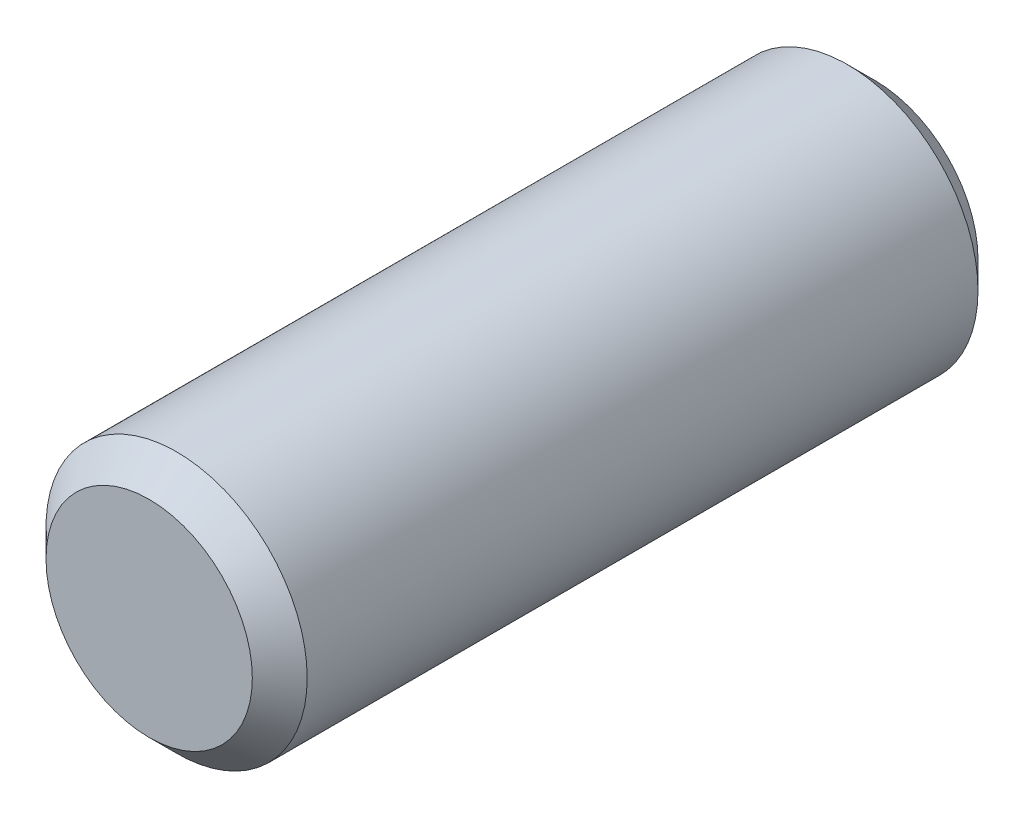
ISO-10303-21;
HEADER;
FILE_DESCRIPTION(('STEP AP214'),'2;1');
FILE_NAME('part.step','',(''),(''),'','','');
FILE_SCHEMA(('AUTOMOTIVE_DESIGN { 1 0 10303 214 1 1 1 1 }'));
ENDSEC;
DATA;
#1=APPLICATION_CONTEXT('core data for automotive mechanical design processes');
#2=APPLICATION_PROTOCOL_DEFINITION('international standard','automotive_design',2000,#1);
#3=PRODUCT_CONTEXT('',#1,'mechanical');
#4=PRODUCT('Part','Part','',(#3));
#5=PRODUCT_RELATED_PRODUCT_CATEGORY('part','',(#4));
#6=PRODUCT_DEFINITION_FORMATION('','',#4);
#7=PRODUCT_DEFINITION_CONTEXT('part definition',#1,'design');
#8=PRODUCT_DEFINITION('design','',#6,#7);
#9=PRODUCT_DEFINITION_SHAPE('','',#8);
#10=(LENGTH_UNIT() NAMED_UNIT(*) SI_UNIT(.MILLI.,.METRE.));
#11=(NAMED_UNIT(*) PLANE_ANGLE_UNIT() SI_UNIT($,.RADIAN.));
#12=(NAMED_UNIT(*) SI_UNIT($,.STERADIAN.) SOLID_ANGLE_UNIT());
#13=UNCERTAINTY_MEASURE_WITH_UNIT(LENGTH_MEASURE(1.E-05),#10,'distance_accuracy_value','');
#14=(GEOMETRIC_REPRESENTATION_CONTEXT(3) GLOBAL_UNCERTAINTY_ASSIGNED_CONTEXT((#13)) GLOBAL_UNIT_ASSIGNED_CONTEXT((#10,
#11,#12)) REPRESENTATION_CONTEXT('',''));
#15=CARTESIAN_POINT('',(0.,0.,0.));
#16=DIRECTION('',(0.,0.,1.));
#17=DIRECTION('',(1.,0.,0.));
#18=AXIS2_PLACEMENT_3D('',#15,#16,#17);
#19=CARTESIAN_POINT('',(0.,0.,26.45));
#20=DIRECTION('',(0.,0.,-1.));
#21=DIRECTION('',(-1.,0.,0.));
#22=AXIS2_PLACEMENT_3D('',#19,#20,#21);
#23=CYLINDRICAL_SURFACE('',#22,9.52);
#24=CARTESIAN_POINT('',(0.,0.,-24.45));
#25=DIRECTION('',(0.,0.,1.));
#26=DIRECTION('',(1.,0.,0.));
#27=AXIS2_PLACEMENT_3D('',#24,#25,#26);
#28=CIRCLE('',#27,9.52);
#29=CARTESIAN_POINT('',(9.52,0.,-24.45));
#30=VERTEX_POINT('',#29);
#31=EDGE_CURVE('E50',#30,#30,#28,.T.);
#32=ORIENTED_EDGE('',*,*,#31,.T.);
#33=EDGE_LOOP('',(#32));
#34=FACE_BOUND('',#33,.T.);
#35=CARTESIAN_POINT('',(0.,0.,24.45));
#36=DIRECTION('',(0.,0.,1.));
#37=DIRECTION('',(1.,0.,0.));
#38=AXIS2_PLACEMENT_3D('',#35,#36,#37);
#39=CIRCLE('',#38,9.52);
#40=CARTESIAN_POINT('',(9.52,0.,24.45));
#41=VERTEX_POINT('',#40);
#42=EDGE_CURVE('E54',#41,#41,#39,.F.);
#43=ORIENTED_EDGE('',*,*,#42,.T.);
#44=EDGE_LOOP('',(#43));
#45=FACE_BOUND('',#44,.T.);
#46=ADVANCED_FACE('F39',(#34,#45),#23,.T.);
#47=CARTESIAN_POINT('',(0.,0.,26.45));
#48=DIRECTION('',(0.,0.,1.));
#49=DIRECTION('',(1.,0.,0.));
#50=AXIS2_PLACEMENT_3D('',#47,#48,#49);
#51=PLANE('',#50);
#52=CARTESIAN_POINT('',(0.,0.,26.45));
#53=DIRECTION('',(0.,0.,1.));
#54=DIRECTION('',(1.,0.,0.));
#55=AXIS2_PLACEMENT_3D('',#52,#53,#54);
#56=CIRCLE('',#55,7.51999999999999);
#57=CARTESIAN_POINT('',(7.51999999999999,0.,26.45));
#58=VERTEX_POINT('',#57);
#59=EDGE_CURVE('E10',#58,#58,#56,.T.);
#60=ORIENTED_EDGE('',*,*,#59,.T.);
#61=EDGE_LOOP('',(#60));
#62=FACE_BOUND('',#61,.T.);
#63=ADVANCED_FACE('F70',(#62),#51,.T.);
#64=CARTESIAN_POINT('',(0.,0.,-26.45));
#65=DIRECTION('',(0.,0.,1.));
#66=DIRECTION('',(1.,0.,0.));
#67=AXIS2_PLACEMENT_3D('',#64,#65,#66);
#68=PLANE('',#67);
#69=CARTESIAN_POINT('',(0.,0.,-26.45));
#70=DIRECTION('',(0.,0.,1.));
#71=DIRECTION('',(1.,0.,0.));
#72=AXIS2_PLACEMENT_3D('',#69,#70,#71);
#73=CIRCLE('',#72,7.51999999999997);
#74=CARTESIAN_POINT('',(7.51999999999997,0.,-26.45));
#75=VERTEX_POINT('',#74);
#76=EDGE_CURVE('E46',#75,#75,#73,.F.);
#77=ORIENTED_EDGE('',*,*,#76,.T.);
#78=EDGE_LOOP('',(#77));
#79=FACE_BOUND('',#78,.T.);
#80=ADVANCED_FACE('F67',(#79),#68,.F.);
#81=CARTESIAN_POINT('',(0.,0.,-24.45));
#82=DIRECTION('',(0.,0.,1.));
#83=DIRECTION('',(1.,0.,0.));
#84=AXIS2_PLACEMENT_3D('',#81,#82,#83);
#85=CONICAL_SURFACE('',#84,9.52,0.785398163397451);
#86=ORIENTED_EDGE('',*,*,#76,.F.);
#87=EDGE_LOOP('',(#86));
#88=FACE_BOUND('',#87,.T.);
#89=ORIENTED_EDGE('',*,*,#31,.F.);
#90=EDGE_LOOP('',(#89));
#91=FACE_BOUND('',#90,.T.);
#92=ADVANCED_FACE('F63',(#88,#91),#85,.T.);
#93=CARTESIAN_POINT('',(0.,0.,26.45));
#94=DIRECTION('',(0.,0.,-1.));
#95=DIRECTION('',(-1.,0.,0.));
#96=AXIS2_PLACEMENT_3D('',#93,#94,#95);
#97=CONICAL_SURFACE('',#96,7.51999999999999,0.785398163397447);
#98=ORIENTED_EDGE('',*,*,#42,.F.);
#99=EDGE_LOOP('',(#98));
#100=FACE_BOUND('',#99,.T.);
#101=ORIENTED_EDGE('',*,*,#59,.F.);
#102=EDGE_LOOP('',(#101));
#103=FACE_BOUND('',#102,.T.);
#104=ADVANCED_FACE('F41',(#100,#103),#97,.T.);
#105=CLOSED_SHELL('',(#46,#63,#80,#92,#104));
#106=MANIFOLD_SOLID_BREP('B2',#105);
#107=ADVANCED_BREP_SHAPE_REPRESENTATION('',(#18,#106),#14);
#108=SHAPE_DEFINITION_REPRESENTATION(#9,#107);
ENDSEC;
END-ISO-10303-21;
